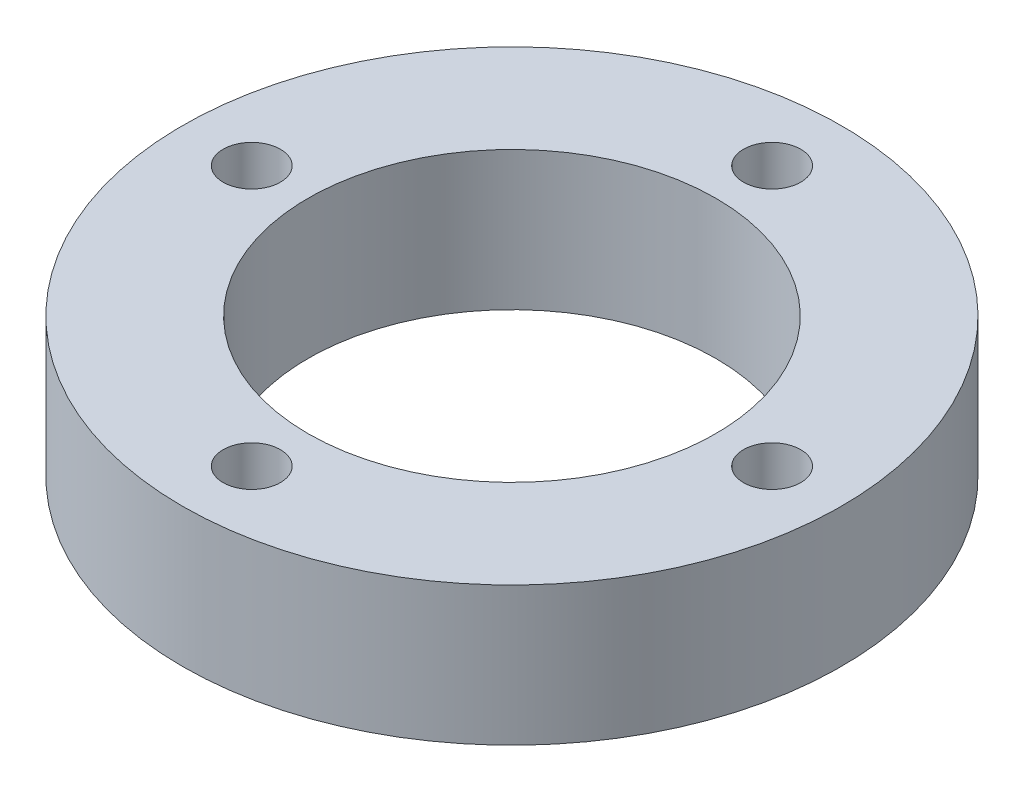
ISO-10303-21;
HEADER;
FILE_DESCRIPTION(('STEP AP214'),'2;1');
FILE_NAME('part.step','',(''),(''),'','','');
FILE_SCHEMA(('AUTOMOTIVE_DESIGN { 1 0 10303 214 1 1 1 1 }'));
ENDSEC;
DATA;
#1=APPLICATION_CONTEXT('core data for automotive mechanical design processes');
#2=APPLICATION_PROTOCOL_DEFINITION('international standard','automotive_design',2000,#1);
#3=PRODUCT_CONTEXT('',#1,'mechanical');
#4=PRODUCT('Part','Part','',(#3));
#5=PRODUCT_RELATED_PRODUCT_CATEGORY('part','',(#4));
#6=PRODUCT_DEFINITION_FORMATION('','',#4);
#7=PRODUCT_DEFINITION_CONTEXT('part definition',#1,'design');
#8=PRODUCT_DEFINITION('design','',#6,#7);
#9=PRODUCT_DEFINITION_SHAPE('','',#8);
#10=(LENGTH_UNIT() NAMED_UNIT(*) SI_UNIT(.MILLI.,.METRE.));
#11=(NAMED_UNIT(*) PLANE_ANGLE_UNIT() SI_UNIT($,.RADIAN.));
#12=(NAMED_UNIT(*) SI_UNIT($,.STERADIAN.) SOLID_ANGLE_UNIT());
#13=UNCERTAINTY_MEASURE_WITH_UNIT(LENGTH_MEASURE(1.E-05),#10,'distance_accuracy_value','');
#14=(GEOMETRIC_REPRESENTATION_CONTEXT(3) GLOBAL_UNCERTAINTY_ASSIGNED_CONTEXT((#13)) GLOBAL_UNIT_ASSIGNED_CONTEXT((#10,
#11,#12)) REPRESENTATION_CONTEXT('',''));
#15=CARTESIAN_POINT('',(0.,0.,0.));
#16=DIRECTION('',(0.,0.,1.));
#17=DIRECTION('',(1.,0.,0.));
#18=AXIS2_PLACEMENT_3D('',#15,#16,#17);
#19=CARTESIAN_POINT('',(0.,16.,0.));
#20=DIRECTION('',(0.,1.,0.));
#21=DIRECTION('',(0.,0.,1.));
#22=AXIS2_PLACEMENT_3D('',#19,#20,#21);
#23=PLANE('',#22);
#24=CARTESIAN_POINT('',(0.,16.,30.));
#25=DIRECTION('',(0.,1.,0.));
#26=DIRECTION('',(0.,0.,1.));
#27=AXIS2_PLACEMENT_3D('',#24,#25,#26);
#28=CIRCLE('',#27,3.3);
#29=CARTESIAN_POINT('',(0.,16.,33.3));
#30=VERTEX_POINT('',#29);
#31=EDGE_CURVE('E65',#30,#30,#28,.T.);
#32=ORIENTED_EDGE('',*,*,#31,.F.);
#33=EDGE_LOOP('',(#32));
#34=FACE_BOUND('',#33,.T.);
#35=CARTESIAN_POINT('',(-30.,16.,0.));
#36=DIRECTION('',(0.,1.,0.));
#37=DIRECTION('',(0.,0.,1.));
#38=AXIS2_PLACEMENT_3D('',#35,#36,#37);
#39=CIRCLE('',#38,3.3);
#40=CARTESIAN_POINT('',(-30.,16.,3.3));
#41=VERTEX_POINT('',#40);
#42=EDGE_CURVE('E52',#41,#41,#39,.T.);
#43=ORIENTED_EDGE('',*,*,#42,.F.);
#44=EDGE_LOOP('',(#43));
#45=FACE_BOUND('',#44,.T.);
#46=CARTESIAN_POINT('',(0.,16.,0.));
#47=DIRECTION('',(0.,1.,0.));
#48=DIRECTION('',(0.,0.,1.));
#49=AXIS2_PLACEMENT_3D('',#46,#47,#48);
#50=CIRCLE('',#49,38.);
#51=CARTESIAN_POINT('',(0.,16.,38.));
#52=VERTEX_POINT('',#51);
#53=EDGE_CURVE('E10',#52,#52,#50,.T.);
#54=ORIENTED_EDGE('',*,*,#53,.T.);
#55=EDGE_LOOP('',(#54));
#56=FACE_BOUND('',#55,.T.);
#57=CARTESIAN_POINT('',(0.,16.,0.));
#58=DIRECTION('',(0.,1.,0.));
#59=DIRECTION('',(0.,0.,1.));
#60=AXIS2_PLACEMENT_3D('',#57,#58,#59);
#61=CIRCLE('',#60,23.51);
#62=CARTESIAN_POINT('',(0.,16.,23.51));
#63=VERTEX_POINT('',#62);
#64=EDGE_CURVE('E48',#63,#63,#61,.T.);
#65=ORIENTED_EDGE('',*,*,#64,.F.);
#66=EDGE_LOOP('',(#65));
#67=FACE_BOUND('',#66,.T.);
#68=CARTESIAN_POINT('',(30.,16.,0.));
#69=DIRECTION('',(0.,1.,0.));
#70=DIRECTION('',(0.,0.,1.));
#71=AXIS2_PLACEMENT_3D('',#68,#69,#70);
#72=CIRCLE('',#71,3.3);
#73=CARTESIAN_POINT('',(30.,16.,3.3));
#74=VERTEX_POINT('',#73);
#75=EDGE_CURVE('E56',#74,#74,#72,.T.);
#76=ORIENTED_EDGE('',*,*,#75,.F.);
#77=EDGE_LOOP('',(#76));
#78=FACE_BOUND('',#77,.T.);
#79=CARTESIAN_POINT('',(0.,16.,-30.));
#80=DIRECTION('',(0.,1.,0.));
#81=DIRECTION('',(0.,0.,1.));
#82=AXIS2_PLACEMENT_3D('',#79,#80,#81);
#83=CIRCLE('',#82,3.3);
#84=CARTESIAN_POINT('',(0.,16.,-26.7));
#85=VERTEX_POINT('',#84);
#86=EDGE_CURVE('E71',#85,#85,#83,.T.);
#87=ORIENTED_EDGE('',*,*,#86,.F.);
#88=EDGE_LOOP('',(#87));
#89=FACE_BOUND('',#88,.T.);
#90=ADVANCED_FACE('F40',(#34,#45,#56,#67,#78,#89),#23,.T.);
#91=CARTESIAN_POINT('',(0.,0.,0.));
#92=DIRECTION('',(0.,1.,0.));
#93=DIRECTION('',(0.,0.,1.));
#94=AXIS2_PLACEMENT_3D('',#91,#92,#93);
#95=PLANE('',#94);
#96=CARTESIAN_POINT('',(0.,0.,0.));
#97=DIRECTION('',(0.,1.,0.));
#98=DIRECTION('',(0.,0.,1.));
#99=AXIS2_PLACEMENT_3D('',#96,#97,#98);
#100=CIRCLE('',#99,38.);
#101=CARTESIAN_POINT('',(0.,0.,38.));
#102=VERTEX_POINT('',#101);
#103=EDGE_CURVE('E41',#102,#102,#100,.T.);
#104=ORIENTED_EDGE('',*,*,#103,.F.);
#105=EDGE_LOOP('',(#104));
#106=FACE_BOUND('',#105,.T.);
#107=CARTESIAN_POINT('',(0.,0.,0.));
#108=DIRECTION('',(0.,1.,0.));
#109=DIRECTION('',(0.,0.,1.));
#110=AXIS2_PLACEMENT_3D('',#107,#108,#109);
#111=CIRCLE('',#110,23.51);
#112=CARTESIAN_POINT('',(0.,0.,23.51));
#113=VERTEX_POINT('',#112);
#114=EDGE_CURVE('E49',#113,#113,#111,.T.);
#115=ORIENTED_EDGE('',*,*,#114,.T.);
#116=EDGE_LOOP('',(#115));
#117=FACE_BOUND('',#116,.T.);
#118=CARTESIAN_POINT('',(-30.,0.,0.));
#119=DIRECTION('',(0.,1.,0.));
#120=DIRECTION('',(0.,0.,1.));
#121=AXIS2_PLACEMENT_3D('',#118,#119,#120);
#122=CIRCLE('',#121,3.3);
#123=CARTESIAN_POINT('',(-30.,0.,3.3));
#124=VERTEX_POINT('',#123);
#125=EDGE_CURVE('E57',#124,#124,#122,.T.);
#126=ORIENTED_EDGE('',*,*,#125,.T.);
#127=EDGE_LOOP('',(#126));
#128=FACE_BOUND('',#127,.T.);
#129=CARTESIAN_POINT('',(30.,0.,0.));
#130=DIRECTION('',(0.,1.,0.));
#131=DIRECTION('',(0.,0.,1.));
#132=AXIS2_PLACEMENT_3D('',#129,#130,#131);
#133=CIRCLE('',#132,3.3);
#134=CARTESIAN_POINT('',(30.,0.,3.3));
#135=VERTEX_POINT('',#134);
#136=EDGE_CURVE('E62',#135,#135,#133,.T.);
#137=ORIENTED_EDGE('',*,*,#136,.T.);
#138=EDGE_LOOP('',(#137));
#139=FACE_BOUND('',#138,.T.);
#140=CARTESIAN_POINT('',(0.,0.,30.));
#141=DIRECTION('',(0.,1.,0.));
#142=DIRECTION('',(0.,0.,1.));
#143=AXIS2_PLACEMENT_3D('',#140,#141,#142);
#144=CIRCLE('',#143,3.3);
#145=CARTESIAN_POINT('',(0.,0.,33.3));
#146=VERTEX_POINT('',#145);
#147=EDGE_CURVE('E66',#146,#146,#144,.T.);
#148=ORIENTED_EDGE('',*,*,#147,.T.);
#149=EDGE_LOOP('',(#148));
#150=FACE_BOUND('',#149,.T.);
#151=CARTESIAN_POINT('',(0.,0.,-30.));
#152=DIRECTION('',(0.,1.,0.));
#153=DIRECTION('',(0.,0.,1.));
#154=AXIS2_PLACEMENT_3D('',#151,#152,#153);
#155=CIRCLE('',#154,3.3);
#156=CARTESIAN_POINT('',(0.,0.,-26.7));
#157=VERTEX_POINT('',#156);
#158=EDGE_CURVE('E73',#157,#157,#155,.T.);
#159=ORIENTED_EDGE('',*,*,#158,.T.);
#160=EDGE_LOOP('',(#159));
#161=FACE_BOUND('',#160,.T.);
#162=ADVANCED_FACE('F84',(#106,#117,#128,#139,#150,#161),#95,.F.);
#163=CARTESIAN_POINT('',(0.,16.,0.));
#164=DIRECTION('',(0.,-1.,0.));
#165=DIRECTION('',(0.,0.,-1.));
#166=AXIS2_PLACEMENT_3D('',#163,#164,#165);
#167=CYLINDRICAL_SURFACE('',#166,38.);
#168=ORIENTED_EDGE('',*,*,#53,.F.);
#169=EDGE_LOOP('',(#168));
#170=FACE_BOUND('',#169,.T.);
#171=ORIENTED_EDGE('',*,*,#103,.T.);
#172=EDGE_LOOP('',(#171));
#173=FACE_BOUND('',#172,.T.);
#174=ADVANCED_FACE('F39',(#170,#173),#167,.T.);
#175=CARTESIAN_POINT('',(0.,16.,0.));
#176=DIRECTION('',(0.,-1.,0.));
#177=DIRECTION('',(0.,0.,-1.));
#178=AXIS2_PLACEMENT_3D('',#175,#176,#177);
#179=CYLINDRICAL_SURFACE('',#178,23.51);
#180=ORIENTED_EDGE('',*,*,#64,.T.);
#181=EDGE_LOOP('',(#180));
#182=FACE_BOUND('',#181,.T.);
#183=ORIENTED_EDGE('',*,*,#114,.F.);
#184=EDGE_LOOP('',(#183));
#185=FACE_BOUND('',#184,.T.);
#186=ADVANCED_FACE('F92',(#182,#185),#179,.F.);
#187=CARTESIAN_POINT('',(-30.,16.,0.));
#188=DIRECTION('',(0.,-1.,0.));
#189=DIRECTION('',(0.,0.,-1.));
#190=AXIS2_PLACEMENT_3D('',#187,#188,#189);
#191=CYLINDRICAL_SURFACE('',#190,3.3);
#192=ORIENTED_EDGE('',*,*,#42,.T.);
#193=EDGE_LOOP('',(#192));
#194=FACE_BOUND('',#193,.T.);
#195=ORIENTED_EDGE('',*,*,#125,.F.);
#196=EDGE_LOOP('',(#195));
#197=FACE_BOUND('',#196,.T.);
#198=ADVANCED_FACE('F100',(#194,#197),#191,.F.);
#199=CARTESIAN_POINT('',(30.,16.,0.));
#200=DIRECTION('',(0.,-1.,0.));
#201=DIRECTION('',(0.,0.,-1.));
#202=AXIS2_PLACEMENT_3D('',#199,#200,#201);
#203=CYLINDRICAL_SURFACE('',#202,3.3);
#204=ORIENTED_EDGE('',*,*,#75,.T.);
#205=EDGE_LOOP('',(#204));
#206=FACE_BOUND('',#205,.T.);
#207=ORIENTED_EDGE('',*,*,#136,.F.);
#208=EDGE_LOOP('',(#207));
#209=FACE_BOUND('',#208,.T.);
#210=ADVANCED_FACE('F102',(#206,#209),#203,.F.);
#211=CARTESIAN_POINT('',(0.,16.,30.));
#212=DIRECTION('',(0.,-1.,0.));
#213=DIRECTION('',(0.,0.,-1.));
#214=AXIS2_PLACEMENT_3D('',#211,#212,#213);
#215=CYLINDRICAL_SURFACE('',#214,3.3);
#216=ORIENTED_EDGE('',*,*,#31,.T.);
#217=EDGE_LOOP('',(#216));
#218=FACE_BOUND('',#217,.T.);
#219=ORIENTED_EDGE('',*,*,#147,.F.);
#220=EDGE_LOOP('',(#219));
#221=FACE_BOUND('',#220,.T.);
#222=ADVANCED_FACE('F103',(#218,#221),#215,.F.);
#223=CARTESIAN_POINT('',(0.,16.,-30.));
#224=DIRECTION('',(0.,-1.,0.));
#225=DIRECTION('',(0.,0.,-1.));
#226=AXIS2_PLACEMENT_3D('',#223,#224,#225);
#227=CYLINDRICAL_SURFACE('',#226,3.3);
#228=ORIENTED_EDGE('',*,*,#86,.T.);
#229=EDGE_LOOP('',(#228));
#230=FACE_BOUND('',#229,.T.);
#231=ORIENTED_EDGE('',*,*,#158,.F.);
#232=EDGE_LOOP('',(#231));
#233=FACE_BOUND('',#232,.T.);
#234=ADVANCED_FACE('F79',(#230,#233),#227,.F.);
#235=CLOSED_SHELL('',(#90,#162,#174,#186,#198,#210,#222,#234));
#236=MANIFOLD_SOLID_BREP('B2',#235);
#237=ADVANCED_BREP_SHAPE_REPRESENTATION('',(#18,#236),#14);
#238=SHAPE_DEFINITION_REPRESENTATION(#9,#237);
ENDSEC;
END-ISO-10303-21;
